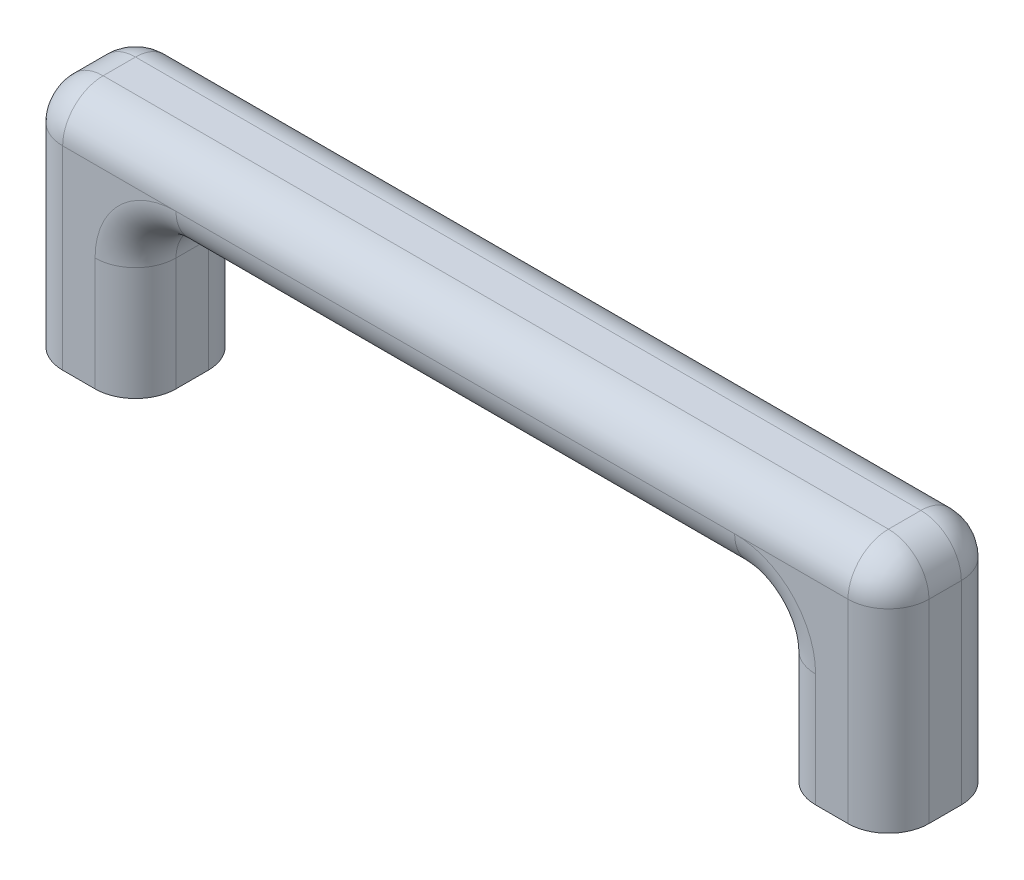
ISO-10303-21;
HEADER;
FILE_DESCRIPTION(('STEP AP214'),'2;1');
FILE_NAME('part.step','',(''),(''),'','','');
FILE_SCHEMA(('AUTOMOTIVE_DESIGN { 1 0 10303 214 1 1 1 1 }'));
ENDSEC;
DATA;
#1=APPLICATION_CONTEXT('core data for automotive mechanical design processes');
#2=APPLICATION_PROTOCOL_DEFINITION('international standard','automotive_design',2000,#1);
#3=PRODUCT_CONTEXT('',#1,'mechanical');
#4=PRODUCT('Part','Part','',(#3));
#5=PRODUCT_RELATED_PRODUCT_CATEGORY('part','',(#4));
#6=PRODUCT_DEFINITION_FORMATION('','',#4);
#7=PRODUCT_DEFINITION_CONTEXT('part definition',#1,'design');
#8=PRODUCT_DEFINITION('design','',#6,#7);
#9=PRODUCT_DEFINITION_SHAPE('','',#8);
#10=(LENGTH_UNIT() NAMED_UNIT(*) SI_UNIT(.MILLI.,.METRE.));
#11=(NAMED_UNIT(*) PLANE_ANGLE_UNIT() SI_UNIT($,.RADIAN.));
#12=(NAMED_UNIT(*) SI_UNIT($,.STERADIAN.) SOLID_ANGLE_UNIT());
#13=UNCERTAINTY_MEASURE_WITH_UNIT(LENGTH_MEASURE(1.E-05),#10,'distance_accuracy_value','');
#14=(GEOMETRIC_REPRESENTATION_CONTEXT(3) GLOBAL_UNCERTAINTY_ASSIGNED_CONTEXT((#13)) GLOBAL_UNIT_ASSIGNED_CONTEXT((#10,
#11,#12)) REPRESENTATION_CONTEXT('',''));
#15=CARTESIAN_POINT('',(0.,0.,0.));
#16=DIRECTION('',(0.,0.,1.));
#17=DIRECTION('',(1.,0.,0.));
#18=AXIS2_PLACEMENT_3D('',#15,#16,#17);
#19=CARTESIAN_POINT('',(0.,0.,14.));
#20=DIRECTION('',(0.,0.,-1.));
#21=DIRECTION('',(-1.,0.,0.));
#22=AXIS2_PLACEMENT_3D('',#19,#20,#21);
#23=PLANE('',#22);
#24=CARTESIAN_POINT('',(34.5,-0.499999999999996,14.));
#25=DIRECTION('',(0.,0.,-1.));
#26=DIRECTION('',(-1.,0.,0.));
#27=AXIS2_PLACEMENT_3D('',#24,#25,#26);
#28=CIRCLE('',#27,10.);
#29=CARTESIAN_POINT('',(44.5,-0.499999999999996,14.));
#30=VERTEX_POINT('',#29);
#31=CARTESIAN_POINT('',(34.5,9.50000000000001,14.));
#32=VERTEX_POINT('',#31);
#33=EDGE_CURVE('E264',#30,#32,#28,.F.);
#34=ORIENTED_EDGE('',*,*,#33,.F.);
#35=DIRECTION('',(0.,1.,0.));
#36=VECTOR('',#35,1.);
#37=CARTESIAN_POINT('',(44.5,0.,14.));
#38=LINE('',#37,#36);
#39=CARTESIAN_POINT('',(44.5,-14.5,14.));
#40=VERTEX_POINT('',#39);
#41=EDGE_CURVE('E200',#30,#40,#38,.F.);
#42=ORIENTED_EDGE('',*,*,#41,.T.);
#43=DIRECTION('',(1.,0.,0.));
#44=VECTOR('',#43,1.);
#45=CARTESIAN_POINT('',(-53.5,-14.5,14.));
#46=LINE('',#45,#44);
#47=CARTESIAN_POINT('',(48.5,-14.5,14.));
#48=VERTEX_POINT('',#47);
#49=EDGE_CURVE('E209',#40,#48,#46,.T.);
#50=ORIENTED_EDGE('',*,*,#49,.T.);
#51=DIRECTION('',(0.,1.,0.));
#52=VECTOR('',#51,1.);
#53=CARTESIAN_POINT('',(48.5,0.,14.));
#54=LINE('',#53,#52);
#55=CARTESIAN_POINT('',(48.5,9.50000000000001,14.));
#56=VERTEX_POINT('',#55);
#57=EDGE_CURVE('E260',#48,#56,#54,.T.);
#58=ORIENTED_EDGE('',*,*,#57,.T.);
#59=DIRECTION('',(-1.,0.,0.));
#60=VECTOR('',#59,1.);
#61=CARTESIAN_POINT('',(0.,9.50000000000001,14.));
#62=LINE('',#61,#60);
#63=EDGE_CURVE('E262',#56,#32,#62,.T.);
#64=ORIENTED_EDGE('',*,*,#63,.T.);
#65=EDGE_LOOP('',(#34,#42,#50,#58,#64));
#66=FACE_BOUND('',#65,.T.);
#67=ADVANCED_FACE('F43',(#66),#23,.F.);
#68=CARTESIAN_POINT('',(0.,0.,0.));
#69=DIRECTION('',(0.,0.,-1.));
#70=DIRECTION('',(-1.,0.,0.));
#71=AXIS2_PLACEMENT_3D('',#68,#69,#70);
#72=PLANE('',#71);
#73=DIRECTION('',(1.,0.,0.));
#74=VECTOR('',#73,1.);
#75=CARTESIAN_POINT('',(-53.5,-14.5,0.));
#76=LINE('',#75,#74);
#77=CARTESIAN_POINT('',(44.5,-14.5,0.));
#78=VERTEX_POINT('',#77);
#79=CARTESIAN_POINT('',(48.5,-14.5,0.));
#80=VERTEX_POINT('',#79);
#81=EDGE_CURVE('E210',#78,#80,#76,.T.);
#82=ORIENTED_EDGE('',*,*,#81,.F.);
#83=DIRECTION('',(0.,1.,0.));
#84=VECTOR('',#83,1.);
#85=CARTESIAN_POINT('',(44.5,4.5,0.));
#86=LINE('',#85,#84);
#87=CARTESIAN_POINT('',(44.5,-0.499999999999996,0.));
#88=VERTEX_POINT('',#87);
#89=EDGE_CURVE('E234',#78,#88,#86,.T.);
#90=ORIENTED_EDGE('',*,*,#89,.T.);
#91=CARTESIAN_POINT('',(34.5,-0.499999999999996,0.));
#92=DIRECTION('',(0.,0.,-1.));
#93=DIRECTION('',(-1.,0.,0.));
#94=AXIS2_PLACEMENT_3D('',#91,#92,#93);
#95=CIRCLE('',#94,10.);
#96=CARTESIAN_POINT('',(34.5,9.50000000000001,0.));
#97=VERTEX_POINT('',#96);
#98=EDGE_CURVE('E231',#97,#88,#95,.T.);
#99=ORIENTED_EDGE('',*,*,#98,.F.);
#100=DIRECTION('',(-1.,0.,0.));
#101=VECTOR('',#100,1.);
#102=CARTESIAN_POINT('',(53.5,9.50000000000001,0.));
#103=LINE('',#102,#101);
#104=CARTESIAN_POINT('',(48.5,9.50000000000001,0.));
#105=VERTEX_POINT('',#104);
#106=EDGE_CURVE('E229',#97,#105,#103,.F.);
#107=ORIENTED_EDGE('',*,*,#106,.T.);
#108=DIRECTION('',(0.,1.,0.));
#109=VECTOR('',#108,1.);
#110=CARTESIAN_POINT('',(48.5,-14.5,0.));
#111=LINE('',#110,#109);
#112=EDGE_CURVE('E227',#105,#80,#111,.F.);
#113=ORIENTED_EDGE('',*,*,#112,.T.);
#114=EDGE_LOOP('',(#82,#90,#99,#107,#113));
#115=FACE_BOUND('',#114,.T.);
#116=ADVANCED_FACE('F439',(#115),#72,.T.);
#117=CARTESIAN_POINT('',(-53.5,-14.5,14.));
#118=DIRECTION('',(0.,1.,0.));
#119=DIRECTION('',(0.,0.,1.));
#120=AXIS2_PLACEMENT_3D('',#117,#118,#119);
#121=PLANE('',#120);
#122=CARTESIAN_POINT('',(46.5,-14.5,7.));
#123=DIRECTION('',(0.,-1.,0.));
#124=DIRECTION('',(0.,0.,-1.));
#125=AXIS2_PLACEMENT_3D('',#122,#123,#124);
#126=CIRCLE('',#125,1.5);
#127=CARTESIAN_POINT('',(46.5,-14.5,5.5));
#128=VERTEX_POINT('',#127);
#129=EDGE_CURVE('E841',#128,#128,#126,.T.);
#130=ORIENTED_EDGE('',*,*,#129,.F.);
#131=EDGE_LOOP('',(#130));
#132=FACE_BOUND('',#131,.T.);
#133=DIRECTION('',(0.,0.,1.));
#134=VECTOR('',#133,1.);
#135=CARTESIAN_POINT('',(39.5,-14.5,0.));
#136=LINE('',#135,#134);
#137=CARTESIAN_POINT('',(39.5,-14.5,5.));
#138=VERTEX_POINT('',#137);
#139=CARTESIAN_POINT('',(39.5,-14.5,9.));
#140=VERTEX_POINT('',#139);
#141=EDGE_CURVE('E386',#138,#140,#136,.T.);
#142=ORIENTED_EDGE('',*,*,#141,.F.);
#143=CARTESIAN_POINT('',(44.5,-14.5,5.));
#144=DIRECTION('',(0.,1.,0.));
#145=DIRECTION('',(0.,0.,1.));
#146=AXIS2_PLACEMENT_3D('',#143,#144,#145);
#147=CIRCLE('',#146,5.);
#148=EDGE_CURVE('E249',#138,#78,#147,.F.);
#149=ORIENTED_EDGE('',*,*,#148,.T.);
#150=ORIENTED_EDGE('',*,*,#81,.T.);
#151=CARTESIAN_POINT('',(48.5,-14.5,5.));
#152=DIRECTION('',(0.,1.,0.));
#153=DIRECTION('',(0.,0.,1.));
#154=AXIS2_PLACEMENT_3D('',#151,#152,#153);
#155=CIRCLE('',#154,5.);
#156=CARTESIAN_POINT('',(53.5,-14.5,5.));
#157=VERTEX_POINT('',#156);
#158=EDGE_CURVE('E245',#80,#157,#155,.F.);
#159=ORIENTED_EDGE('',*,*,#158,.T.);
#160=DIRECTION('',(0.,0.,-1.));
#161=VECTOR('',#160,1.);
#162=CARTESIAN_POINT('',(53.5,-14.5,14.));
#163=LINE('',#162,#161);
#164=CARTESIAN_POINT('',(53.5,-14.5,9.));
#165=VERTEX_POINT('',#164);
#166=EDGE_CURVE('E220',#165,#157,#163,.T.);
#167=ORIENTED_EDGE('',*,*,#166,.F.);
#168=CARTESIAN_POINT('',(48.5,-14.5,9.));
#169=DIRECTION('',(0.,1.,0.));
#170=DIRECTION('',(0.,0.,1.));
#171=AXIS2_PLACEMENT_3D('',#168,#169,#170);
#172=CIRCLE('',#171,5.);
#173=EDGE_CURVE('E243',#165,#48,#172,.F.);
#174=ORIENTED_EDGE('',*,*,#173,.T.);
#175=ORIENTED_EDGE('',*,*,#49,.F.);
#176=CARTESIAN_POINT('',(44.5,-14.5,9.));
#177=DIRECTION('',(0.,1.,0.));
#178=DIRECTION('',(0.,0.,1.));
#179=AXIS2_PLACEMENT_3D('',#176,#177,#178);
#180=CIRCLE('',#179,5.);
#181=EDGE_CURVE('E247',#40,#140,#180,.F.);
#182=ORIENTED_EDGE('',*,*,#181,.T.);
#183=EDGE_LOOP('',(#142,#149,#150,#159,#167,#174,#175,#182));
#184=FACE_BOUND('',#183,.T.);
#185=ADVANCED_FACE('F446',(#132,#184),#121,.F.);
#186=CARTESIAN_POINT('',(53.5,-14.5,14.));
#187=DIRECTION('',(-1.,0.,0.));
#188=DIRECTION('',(0.,0.,1.));
#189=AXIS2_PLACEMENT_3D('',#186,#187,#188);
#190=PLANE('',#189);
#191=ORIENTED_EDGE('',*,*,#166,.T.);
#192=DIRECTION('',(0.,1.,0.));
#193=VECTOR('',#192,1.);
#194=CARTESIAN_POINT('',(53.5,14.5,5.));
#195=LINE('',#194,#193);
#196=CARTESIAN_POINT('',(53.5,9.50000000000001,5.));
#197=VERTEX_POINT('',#196);
#198=EDGE_CURVE('E301',#157,#197,#195,.T.);
#199=ORIENTED_EDGE('',*,*,#198,.T.);
#200=DIRECTION('',(0.,0.,-1.));
#201=VECTOR('',#200,1.);
#202=CARTESIAN_POINT('',(53.5,9.5,14.));
#203=LINE('',#202,#201);
#204=CARTESIAN_POINT('',(53.5,9.50000000000001,9.));
#205=VERTEX_POINT('',#204);
#206=EDGE_CURVE('E299',#197,#205,#203,.F.);
#207=ORIENTED_EDGE('',*,*,#206,.T.);
#208=DIRECTION('',(0.,1.,0.));
#209=VECTOR('',#208,1.);
#210=CARTESIAN_POINT('',(53.5,-14.5,9.));
#211=LINE('',#210,#209);
#212=EDGE_CURVE('E297',#205,#165,#211,.F.);
#213=ORIENTED_EDGE('',*,*,#212,.T.);
#214=EDGE_LOOP('',(#191,#199,#207,#213));
#215=FACE_BOUND('',#214,.T.);
#216=ADVANCED_FACE('F401',(#215),#190,.F.);
#217=CARTESIAN_POINT('',(-53.5,14.5,14.));
#218=DIRECTION('',(0.,-1.,0.));
#219=DIRECTION('',(0.,0.,-1.));
#220=AXIS2_PLACEMENT_3D('',#217,#218,#219);
#221=PLANE('',#220);
#222=DIRECTION('',(-1.,0.,0.));
#223=VECTOR('',#222,1.);
#224=CARTESIAN_POINT('',(-53.5,14.5,9.));
#225=LINE('',#224,#223);
#226=CARTESIAN_POINT('',(-48.5,14.5,9.));
#227=VERTEX_POINT('',#226);
#228=CARTESIAN_POINT('',(48.5,14.5,9.));
#229=VERTEX_POINT('',#228);
#230=EDGE_CURVE('E292',#227,#229,#225,.F.);
#231=ORIENTED_EDGE('',*,*,#230,.T.);
#232=DIRECTION('',(0.,0.,-1.));
#233=VECTOR('',#232,1.);
#234=CARTESIAN_POINT('',(48.5,14.5,14.));
#235=LINE('',#234,#233);
#236=CARTESIAN_POINT('',(48.5,14.5,5.));
#237=VERTEX_POINT('',#236);
#238=EDGE_CURVE('E294',#229,#237,#235,.T.);
#239=ORIENTED_EDGE('',*,*,#238,.T.);
#240=DIRECTION('',(-1.,0.,0.));
#241=VECTOR('',#240,1.);
#242=CARTESIAN_POINT('',(-53.5,14.5,5.));
#243=LINE('',#242,#241);
#244=CARTESIAN_POINT('',(-48.5,14.5,5.));
#245=VERTEX_POINT('',#244);
#246=EDGE_CURVE('E288',#237,#245,#243,.T.);
#247=ORIENTED_EDGE('',*,*,#246,.T.);
#248=DIRECTION('',(0.,0.,-1.));
#249=VECTOR('',#248,1.);
#250=CARTESIAN_POINT('',(-48.5,14.5,14.));
#251=LINE('',#250,#249);
#252=EDGE_CURVE('E290',#245,#227,#251,.F.);
#253=ORIENTED_EDGE('',*,*,#252,.T.);
#254=EDGE_LOOP('',(#231,#239,#247,#253));
#255=FACE_BOUND('',#254,.T.);
#256=ADVANCED_FACE('F419',(#255),#221,.F.);
#257=CARTESIAN_POINT('',(-53.5,-14.5,14.));
#258=DIRECTION('',(1.,0.,0.));
#259=DIRECTION('',(0.,0.,-1.));
#260=AXIS2_PLACEMENT_3D('',#257,#258,#259);
#261=PLANE('',#260);
#262=DIRECTION('',(0.,0.,-1.));
#263=VECTOR('',#262,1.);
#264=CARTESIAN_POINT('',(-53.5,-14.5,14.));
#265=LINE('',#264,#263);
#266=CARTESIAN_POINT('',(-53.5,-14.5,9.));
#267=VERTEX_POINT('',#266);
#268=CARTESIAN_POINT('',(-53.5,-14.5,5.));
#269=VERTEX_POINT('',#268);
#270=EDGE_CURVE('E196',#267,#269,#265,.T.);
#271=ORIENTED_EDGE('',*,*,#270,.F.);
#272=DIRECTION('',(0.,-1.,0.));
#273=VECTOR('',#272,1.);
#274=CARTESIAN_POINT('',(-53.5,-14.5,9.));
#275=LINE('',#274,#273);
#276=CARTESIAN_POINT('',(-53.5,9.5,9.));
#277=VERTEX_POINT('',#276);
#278=EDGE_CURVE('E11',#267,#277,#275,.F.);
#279=ORIENTED_EDGE('',*,*,#278,.T.);
#280=DIRECTION('',(0.,0.,-1.));
#281=VECTOR('',#280,1.);
#282=CARTESIAN_POINT('',(-53.5,9.5,14.));
#283=LINE('',#282,#281);
#284=CARTESIAN_POINT('',(-53.5,9.5,5.));
#285=VERTEX_POINT('',#284);
#286=EDGE_CURVE('E52',#277,#285,#283,.T.);
#287=ORIENTED_EDGE('',*,*,#286,.T.);
#288=DIRECTION('',(0.,-1.,0.));
#289=VECTOR('',#288,1.);
#290=CARTESIAN_POINT('',(-53.5,-14.5,5.));
#291=LINE('',#290,#289);
#292=EDGE_CURVE('E303',#285,#269,#291,.T.);
#293=ORIENTED_EDGE('',*,*,#292,.T.);
#294=EDGE_LOOP('',(#271,#279,#287,#293));
#295=FACE_BOUND('',#294,.T.);
#296=ADVANCED_FACE('F458',(#295),#261,.F.);
#297=CARTESIAN_POINT('',(-46.5,-14.5,7.));
#298=DIRECTION('',(0.,-1.,0.));
#299=DIRECTION('',(0.,0.,-1.));
#300=AXIS2_PLACEMENT_3D('',#297,#298,#299);
#301=CIRCLE('',#300,1.5);
#302=CARTESIAN_POINT('',(-46.5,-14.5,5.5));
#303=VERTEX_POINT('',#302);
#304=EDGE_CURVE('E843',#303,#303,#301,.T.);
#305=ORIENTED_EDGE('',*,*,#304,.F.);
#306=EDGE_LOOP('',(#305));
#307=FACE_BOUND('',#306,.T.);
#308=CARTESIAN_POINT('',(-48.5,-14.5,0.));
#309=VERTEX_POINT('',#308);
#310=CARTESIAN_POINT('',(-44.5,-14.5,0.));
#311=VERTEX_POINT('',#310);
#312=EDGE_CURVE('E195',#309,#311,#76,.T.);
#313=ORIENTED_EDGE('',*,*,#312,.T.);
#314=CARTESIAN_POINT('',(-44.5,-14.5,5.));
#315=DIRECTION('',(0.,1.,0.));
#316=DIRECTION('',(0.,0.,1.));
#317=AXIS2_PLACEMENT_3D('',#314,#315,#316);
#318=CIRCLE('',#317,5.);
#319=CARTESIAN_POINT('',(-39.5,-14.5,5.));
#320=VERTEX_POINT('',#319);
#321=EDGE_CURVE('E271',#311,#320,#318,.F.);
#322=ORIENTED_EDGE('',*,*,#321,.T.);
#323=DIRECTION('',(0.,0.,1.));
#324=VECTOR('',#323,1.);
#325=CARTESIAN_POINT('',(-39.5,-14.5,0.));
#326=LINE('',#325,#324);
#327=CARTESIAN_POINT('',(-39.5,-14.5,9.));
#328=VERTEX_POINT('',#327);
#329=EDGE_CURVE('E381',#320,#328,#326,.T.);
#330=ORIENTED_EDGE('',*,*,#329,.T.);
#331=CARTESIAN_POINT('',(-44.5,-14.5,9.));
#332=DIRECTION('',(0.,1.,0.));
#333=DIRECTION('',(0.,0.,1.));
#334=AXIS2_PLACEMENT_3D('',#331,#332,#333);
#335=CIRCLE('',#334,5.);
#336=CARTESIAN_POINT('',(-44.5,-14.5,14.));
#337=VERTEX_POINT('',#336);
#338=EDGE_CURVE('E269',#328,#337,#335,.F.);
#339=ORIENTED_EDGE('',*,*,#338,.T.);
#340=CARTESIAN_POINT('',(-48.5,-14.5,14.));
#341=VERTEX_POINT('',#340);
#342=EDGE_CURVE('E394',#341,#337,#46,.T.);
#343=ORIENTED_EDGE('',*,*,#342,.F.);
#344=CARTESIAN_POINT('',(-48.5,-14.5,9.));
#345=DIRECTION('',(0.,1.,0.));
#346=DIRECTION('',(0.,0.,1.));
#347=AXIS2_PLACEMENT_3D('',#344,#345,#346);
#348=CIRCLE('',#347,5.);
#349=EDGE_CURVE('E199',#341,#267,#348,.F.);
#350=ORIENTED_EDGE('',*,*,#349,.T.);
#351=ORIENTED_EDGE('',*,*,#270,.T.);
#352=CARTESIAN_POINT('',(-48.5,-14.5,5.));
#353=DIRECTION('',(0.,1.,0.));
#354=DIRECTION('',(0.,0.,1.));
#355=AXIS2_PLACEMENT_3D('',#352,#353,#354);
#356=CIRCLE('',#355,5.);
#357=EDGE_CURVE('E192',#269,#309,#356,.F.);
#358=ORIENTED_EDGE('',*,*,#357,.T.);
#359=EDGE_LOOP('',(#313,#322,#330,#339,#343,#350,#351,#358));
#360=FACE_BOUND('',#359,.T.);
#361=ADVANCED_FACE('F194',(#307,#360),#121,.F.);
#362=ORIENTED_EDGE('',*,*,#342,.T.);
#363=DIRECTION('',(0.,-1.,0.));
#364=VECTOR('',#363,1.);
#365=CARTESIAN_POINT('',(-44.5,0.,14.));
#366=LINE('',#365,#364);
#367=CARTESIAN_POINT('',(-44.5,-0.499999999999996,14.));
#368=VERTEX_POINT('',#367);
#369=EDGE_CURVE('E258',#337,#368,#366,.F.);
#370=ORIENTED_EDGE('',*,*,#369,.T.);
#371=CARTESIAN_POINT('',(-34.5,-0.499999999999996,14.));
#372=DIRECTION('',(0.,0.,-1.));
#373=DIRECTION('',(-1.,0.,0.));
#374=AXIS2_PLACEMENT_3D('',#371,#372,#373);
#375=CIRCLE('',#374,10.);
#376=CARTESIAN_POINT('',(-34.5,9.50000000000001,14.));
#377=VERTEX_POINT('',#376);
#378=EDGE_CURVE('E255',#377,#368,#375,.F.);
#379=ORIENTED_EDGE('',*,*,#378,.F.);
#380=DIRECTION('',(-1.,0.,0.));
#381=VECTOR('',#380,1.);
#382=CARTESIAN_POINT('',(0.,9.50000000000001,14.));
#383=LINE('',#382,#381);
#384=CARTESIAN_POINT('',(-48.5,9.50000000000001,14.));
#385=VERTEX_POINT('',#384);
#386=EDGE_CURVE('E253',#377,#385,#383,.T.);
#387=ORIENTED_EDGE('',*,*,#386,.T.);
#388=DIRECTION('',(0.,-1.,0.));
#389=VECTOR('',#388,1.);
#390=CARTESIAN_POINT('',(-48.5,0.,14.));
#391=LINE('',#390,#389);
#392=EDGE_CURVE('E251',#385,#341,#391,.T.);
#393=ORIENTED_EDGE('',*,*,#392,.T.);
#394=EDGE_LOOP('',(#362,#370,#379,#387,#393));
#395=FACE_BOUND('',#394,.T.);
#396=ADVANCED_FACE('F442',(#395),#23,.F.);
#397=CARTESIAN_POINT('',(-34.5,-0.499999999999996,0.));
#398=DIRECTION('',(0.,0.,-1.));
#399=DIRECTION('',(-1.,0.,0.));
#400=AXIS2_PLACEMENT_3D('',#397,#398,#399);
#401=CIRCLE('',#400,10.);
#402=CARTESIAN_POINT('',(-44.5,-0.499999999999996,0.));
#403=VERTEX_POINT('',#402);
#404=CARTESIAN_POINT('',(-34.5,9.50000000000001,0.));
#405=VERTEX_POINT('',#404);
#406=EDGE_CURVE('E218',#403,#405,#401,.T.);
#407=ORIENTED_EDGE('',*,*,#406,.F.);
#408=DIRECTION('',(0.,-1.,0.));
#409=VECTOR('',#408,1.);
#410=CARTESIAN_POINT('',(-44.5,-14.5,0.));
#411=LINE('',#410,#409);
#412=EDGE_CURVE('E208',#403,#311,#411,.T.);
#413=ORIENTED_EDGE('',*,*,#412,.T.);
#414=ORIENTED_EDGE('',*,*,#312,.F.);
#415=DIRECTION('',(0.,-1.,0.));
#416=VECTOR('',#415,1.);
#417=CARTESIAN_POINT('',(-48.5,14.5,0.));
#418=LINE('',#417,#416);
#419=CARTESIAN_POINT('',(-48.5,9.50000000000001,0.));
#420=VERTEX_POINT('',#419);
#421=EDGE_CURVE('E205',#309,#420,#418,.F.);
#422=ORIENTED_EDGE('',*,*,#421,.T.);
#423=DIRECTION('',(-1.,0.,0.));
#424=VECTOR('',#423,1.);
#425=CARTESIAN_POINT('',(53.5,9.50000000000001,0.));
#426=LINE('',#425,#424);
#427=EDGE_CURVE('E216',#420,#405,#426,.F.);
#428=ORIENTED_EDGE('',*,*,#427,.T.);
#429=EDGE_LOOP('',(#407,#413,#414,#422,#428));
#430=FACE_BOUND('',#429,.T.);
#431=ADVANCED_FACE('F204',(#430),#72,.T.);
#432=CARTESIAN_POINT('',(39.5,4.5,0.));
#433=DIRECTION('',(1.,0.,0.));
#434=DIRECTION('',(0.,0.,-1.));
#435=AXIS2_PLACEMENT_3D('',#432,#433,#434);
#436=PLANE('',#435);
#437=DIRECTION('',(0.,0.,1.));
#438=VECTOR('',#437,1.);
#439=CARTESIAN_POINT('',(39.5,-0.499999999999996,0.));
#440=LINE('',#439,#438);
#441=CARTESIAN_POINT('',(39.5,-0.499999999999996,9.));
#442=VERTEX_POINT('',#441);
#443=CARTESIAN_POINT('',(39.5,-0.499999999999996,5.));
#444=VERTEX_POINT('',#443);
#445=EDGE_CURVE('E237',#442,#444,#440,.F.);
#446=ORIENTED_EDGE('',*,*,#445,.T.);
#447=DIRECTION('',(0.,1.,0.));
#448=VECTOR('',#447,1.);
#449=CARTESIAN_POINT('',(39.5,-14.5,5.));
#450=LINE('',#449,#448);
#451=EDGE_CURVE('E241',#444,#138,#450,.F.);
#452=ORIENTED_EDGE('',*,*,#451,.T.);
#453=ORIENTED_EDGE('',*,*,#141,.T.);
#454=DIRECTION('',(0.,1.,0.));
#455=VECTOR('',#454,1.);
#456=CARTESIAN_POINT('',(39.5,4.5,9.));
#457=LINE('',#456,#455);
#458=EDGE_CURVE('E239',#140,#442,#457,.T.);
#459=ORIENTED_EDGE('',*,*,#458,.T.);
#460=EDGE_LOOP('',(#446,#452,#453,#459));
#461=FACE_BOUND('',#460,.T.);
#462=ADVANCED_FACE('F456',(#461),#436,.F.);
#463=CARTESIAN_POINT('',(-39.5,4.5,0.));
#464=DIRECTION('',(-1.,0.,0.));
#465=DIRECTION('',(0.,0.,1.));
#466=AXIS2_PLACEMENT_3D('',#463,#464,#465);
#467=PLANE('',#466);
#468=ORIENTED_EDGE('',*,*,#329,.F.);
#469=DIRECTION('',(0.,-1.,0.));
#470=VECTOR('',#469,1.);
#471=CARTESIAN_POINT('',(-39.5,4.5,5.));
#472=LINE('',#471,#470);
#473=CARTESIAN_POINT('',(-39.5,-0.499999999999996,5.));
#474=VERTEX_POINT('',#473);
#475=EDGE_CURVE('E277',#320,#474,#472,.F.);
#476=ORIENTED_EDGE('',*,*,#475,.T.);
#477=DIRECTION('',(0.,0.,1.));
#478=VECTOR('',#477,1.);
#479=CARTESIAN_POINT('',(-39.5,-0.499999999999996,14.));
#480=LINE('',#479,#478);
#481=CARTESIAN_POINT('',(-39.5,-0.499999999999996,9.));
#482=VERTEX_POINT('',#481);
#483=EDGE_CURVE('E275',#474,#482,#480,.T.);
#484=ORIENTED_EDGE('',*,*,#483,.T.);
#485=DIRECTION('',(0.,-1.,0.));
#486=VECTOR('',#485,1.);
#487=CARTESIAN_POINT('',(-39.5,4.5,9.));
#488=LINE('',#487,#486);
#489=EDGE_CURVE('E273',#482,#328,#488,.T.);
#490=ORIENTED_EDGE('',*,*,#489,.T.);
#491=EDGE_LOOP('',(#468,#476,#484,#490));
#492=FACE_BOUND('',#491,.T.);
#493=ADVANCED_FACE('F495',(#492),#467,.F.);
#494=CARTESIAN_POINT('',(-39.5,4.5,0.));
#495=DIRECTION('',(0.,1.,0.));
#496=DIRECTION('',(0.,0.,1.));
#497=AXIS2_PLACEMENT_3D('',#494,#495,#496);
#498=PLANE('',#497);
#499=DIRECTION('',(-1.,0.,0.));
#500=VECTOR('',#499,1.);
#501=CARTESIAN_POINT('',(39.5,4.5,5.));
#502=LINE('',#501,#500);
#503=CARTESIAN_POINT('',(-34.5,4.5,5.));
#504=VERTEX_POINT('',#503);
#505=CARTESIAN_POINT('',(34.5,4.5,5.));
#506=VERTEX_POINT('',#505);
#507=EDGE_CURVE('E283',#504,#506,#502,.F.);
#508=ORIENTED_EDGE('',*,*,#507,.T.);
#509=DIRECTION('',(0.,0.,1.));
#510=VECTOR('',#509,1.);
#511=CARTESIAN_POINT('',(34.5,4.5,14.));
#512=LINE('',#511,#510);
#513=CARTESIAN_POINT('',(34.5,4.5,9.));
#514=VERTEX_POINT('',#513);
#515=EDGE_CURVE('E285',#506,#514,#512,.T.);
#516=ORIENTED_EDGE('',*,*,#515,.T.);
#517=DIRECTION('',(-1.,0.,0.));
#518=VECTOR('',#517,1.);
#519=CARTESIAN_POINT('',(-39.5,4.5,9.));
#520=LINE('',#519,#518);
#521=CARTESIAN_POINT('',(-34.5,4.5,9.));
#522=VERTEX_POINT('',#521);
#523=EDGE_CURVE('E279',#514,#522,#520,.T.);
#524=ORIENTED_EDGE('',*,*,#523,.T.);
#525=DIRECTION('',(0.,0.,1.));
#526=VECTOR('',#525,1.);
#527=CARTESIAN_POINT('',(-34.5,4.5,0.));
#528=LINE('',#527,#526);
#529=EDGE_CURVE('E281',#522,#504,#528,.F.);
#530=ORIENTED_EDGE('',*,*,#529,.T.);
#531=EDGE_LOOP('',(#508,#516,#524,#530));
#532=FACE_BOUND('',#531,.T.);
#533=ADVANCED_FACE('F501',(#532),#498,.F.);
#534=CARTESIAN_POINT('',(-48.5,0.,9.));
#535=DIRECTION('',(0.,-1.,0.));
#536=DIRECTION('',(0.,0.,-1.));
#537=AXIS2_PLACEMENT_3D('',#534,#535,#536);
#538=CYLINDRICAL_SURFACE('',#537,5.);
#539=ORIENTED_EDGE('',*,*,#349,.F.);
#540=ORIENTED_EDGE('',*,*,#392,.F.);
#541=CARTESIAN_POINT('',(-48.5,9.5,9.));
#542=DIRECTION('',(0.,1.,0.));
#543=DIRECTION('',(0.,0.,1.));
#544=AXIS2_PLACEMENT_3D('',#541,#542,#543);
#545=CIRCLE('',#544,5.);
#546=EDGE_CURVE('E47',#277,#385,#545,.T.);
#547=ORIENTED_EDGE('',*,*,#546,.F.);
#548=ORIENTED_EDGE('',*,*,#278,.F.);
#549=EDGE_LOOP('',(#539,#540,#547,#548));
#550=FACE_BOUND('',#549,.T.);
#551=ADVANCED_FACE('F45',(#550),#538,.T.);
#552=CARTESIAN_POINT('',(-44.5,4.5,9.));
#553=DIRECTION('',(0.,-1.,0.));
#554=DIRECTION('',(0.,0.,-1.));
#555=AXIS2_PLACEMENT_3D('',#552,#553,#554);
#556=CYLINDRICAL_SURFACE('',#555,5.);
#557=ORIENTED_EDGE('',*,*,#338,.F.);
#558=ORIENTED_EDGE('',*,*,#489,.F.);
#559=CARTESIAN_POINT('',(-44.5,-0.499999999999996,9.));
#560=DIRECTION('',(0.,1.,0.));
#561=DIRECTION('',(0.,0.,1.));
#562=AXIS2_PLACEMENT_3D('',#559,#560,#561);
#563=CIRCLE('',#562,5.);
#564=EDGE_CURVE('E366',#368,#482,#563,.T.);
#565=ORIENTED_EDGE('',*,*,#564,.F.);
#566=ORIENTED_EDGE('',*,*,#369,.F.);
#567=EDGE_LOOP('',(#557,#558,#565,#566));
#568=FACE_BOUND('',#567,.T.);
#569=ADVANCED_FACE('F467',(#568),#556,.T.);
#570=CARTESIAN_POINT('',(-48.5,9.50000000000001,9.));
#571=DIRECTION('',(-1.,0.,0.));
#572=DIRECTION('',(0.,-1.,0.));
#573=AXIS2_PLACEMENT_3D('',#570,#571,#572);
#574=SPHERICAL_SURFACE('',#573,5.);
#575=CARTESIAN_POINT('',(-48.5,9.50000000000001,9.));
#576=DIRECTION('',(-1.,0.,0.));
#577=DIRECTION('',(0.,0.,1.));
#578=AXIS2_PLACEMENT_3D('',#575,#576,#577);
#579=CIRCLE('',#578,5.);
#580=EDGE_CURVE('E363',#227,#385,#579,.F.);
#581=ORIENTED_EDGE('',*,*,#580,.F.);
#582=CARTESIAN_POINT('',(-48.5,9.50000000000001,9.));
#583=DIRECTION('',(0.,0.,1.));
#584=DIRECTION('',(1.,0.,0.));
#585=AXIS2_PLACEMENT_3D('',#582,#583,#584);
#586=CIRCLE('',#585,5.);
#587=EDGE_CURVE('E369',#277,#227,#586,.F.);
#588=ORIENTED_EDGE('',*,*,#587,.F.);
#589=ORIENTED_EDGE('',*,*,#546,.T.);
#590=EDGE_LOOP('',(#581,#588,#589));
#591=FACE_BOUND('',#590,.T.);
#592=ADVANCED_FACE('F435',(#591),#574,.T.);
#593=CARTESIAN_POINT('',(48.5,0.,9.));
#594=DIRECTION('',(0.,1.,0.));
#595=DIRECTION('',(0.,0.,1.));
#596=AXIS2_PLACEMENT_3D('',#593,#594,#595);
#597=CYLINDRICAL_SURFACE('',#596,5.);
#598=CARTESIAN_POINT('',(48.5,9.50000000000001,9.));
#599=DIRECTION('',(0.,1.,0.));
#600=DIRECTION('',(0.,0.,1.));
#601=AXIS2_PLACEMENT_3D('',#598,#599,#600);
#602=CIRCLE('',#601,5.);
#603=EDGE_CURVE('E374',#56,#205,#602,.T.);
#604=ORIENTED_EDGE('',*,*,#603,.F.);
#605=ORIENTED_EDGE('',*,*,#57,.F.);
#606=ORIENTED_EDGE('',*,*,#173,.F.);
#607=ORIENTED_EDGE('',*,*,#212,.F.);
#608=EDGE_LOOP('',(#604,#605,#606,#607));
#609=FACE_BOUND('',#608,.T.);
#610=ADVANCED_FACE('F428',(#609),#597,.T.);
#611=CARTESIAN_POINT('',(48.5,9.50000000000001,9.));
#612=DIRECTION('',(1.,0.,0.));
#613=DIRECTION('',(0.,0.,-1.));
#614=AXIS2_PLACEMENT_3D('',#611,#612,#613);
#615=SPHERICAL_SURFACE('',#614,5.);
#616=CARTESIAN_POINT('',(48.5,9.50000000000001,9.));
#617=DIRECTION('',(1.,0.,0.));
#618=DIRECTION('',(0.,0.,-1.));
#619=AXIS2_PLACEMENT_3D('',#616,#617,#618);
#620=CIRCLE('',#619,5.);
#621=EDGE_CURVE('E360',#56,#229,#620,.F.);
#622=ORIENTED_EDGE('',*,*,#621,.F.);
#623=ORIENTED_EDGE('',*,*,#603,.T.);
#624=CARTESIAN_POINT('',(48.5,9.50000000000001,9.));
#625=DIRECTION('',(0.,0.,1.));
#626=DIRECTION('',(1.,0.,0.));
#627=AXIS2_PLACEMENT_3D('',#624,#625,#626);
#628=CIRCLE('',#627,5.);
#629=EDGE_CURVE('E372',#229,#205,#628,.F.);
#630=ORIENTED_EDGE('',*,*,#629,.F.);
#631=EDGE_LOOP('',(#622,#623,#630));
#632=FACE_BOUND('',#631,.T.);
#633=ADVANCED_FACE('F426',(#632),#615,.T.);
#634=CARTESIAN_POINT('',(48.5,-14.5,5.));
#635=DIRECTION('',(0.,-1.,0.));
#636=DIRECTION('',(0.,0.,-1.));
#637=AXIS2_PLACEMENT_3D('',#634,#635,#636);
#638=CYLINDRICAL_SURFACE('',#637,5.);
#639=ORIENTED_EDGE('',*,*,#158,.F.);
#640=ORIENTED_EDGE('',*,*,#112,.F.);
#641=CARTESIAN_POINT('',(48.5,9.50000000000001,5.));
#642=DIRECTION('',(0.,1.,0.));
#643=DIRECTION('',(0.,0.,1.));
#644=AXIS2_PLACEMENT_3D('',#641,#642,#643);
#645=CIRCLE('',#644,5.);
#646=EDGE_CURVE('E357',#197,#105,#645,.T.);
#647=ORIENTED_EDGE('',*,*,#646,.F.);
#648=ORIENTED_EDGE('',*,*,#198,.F.);
#649=EDGE_LOOP('',(#639,#640,#647,#648));
#650=FACE_BOUND('',#649,.T.);
#651=ADVANCED_FACE('F409',(#650),#638,.T.);
#652=CARTESIAN_POINT('',(48.5,9.50000000000001,14.));
#653=DIRECTION('',(0.,0.,-1.));
#654=DIRECTION('',(-1.,0.,0.));
#655=AXIS2_PLACEMENT_3D('',#652,#653,#654);
#656=CYLINDRICAL_SURFACE('',#655,5.);
#657=ORIENTED_EDGE('',*,*,#629,.T.);
#658=ORIENTED_EDGE('',*,*,#206,.F.);
#659=CARTESIAN_POINT('',(48.5,9.50000000000001,5.));
#660=DIRECTION('',(0.,0.,-1.));
#661=DIRECTION('',(-1.,0.,0.));
#662=AXIS2_PLACEMENT_3D('',#659,#660,#661);
#663=CIRCLE('',#662,5.);
#664=EDGE_CURVE('E354',#237,#197,#663,.T.);
#665=ORIENTED_EDGE('',*,*,#664,.F.);
#666=ORIENTED_EDGE('',*,*,#238,.F.);
#667=EDGE_LOOP('',(#657,#658,#665,#666));
#668=FACE_BOUND('',#667,.T.);
#669=ADVANCED_FACE('F417',(#668),#656,.T.);
#670=CARTESIAN_POINT('',(-48.5,9.5,14.));
#671=DIRECTION('',(0.,0.,-1.));
#672=DIRECTION('',(-1.,0.,0.));
#673=AXIS2_PLACEMENT_3D('',#670,#671,#672);
#674=CYLINDRICAL_SURFACE('',#673,5.);
#675=ORIENTED_EDGE('',*,*,#587,.T.);
#676=ORIENTED_EDGE('',*,*,#252,.F.);
#677=CARTESIAN_POINT('',(-48.5,9.5,5.));
#678=DIRECTION('',(0.,0.,-1.));
#679=DIRECTION('',(-1.,0.,0.));
#680=AXIS2_PLACEMENT_3D('',#677,#678,#679);
#681=CIRCLE('',#680,5.);
#682=EDGE_CURVE('E351',#285,#245,#681,.T.);
#683=ORIENTED_EDGE('',*,*,#682,.F.);
#684=ORIENTED_EDGE('',*,*,#286,.F.);
#685=EDGE_LOOP('',(#675,#676,#683,#684));
#686=FACE_BOUND('',#685,.T.);
#687=ADVANCED_FACE('F477',(#686),#674,.T.);
#688=CARTESIAN_POINT('',(-48.5,-14.5,5.));
#689=DIRECTION('',(0.,1.,0.));
#690=DIRECTION('',(0.,0.,1.));
#691=AXIS2_PLACEMENT_3D('',#688,#689,#690);
#692=CYLINDRICAL_SURFACE('',#691,5.);
#693=ORIENTED_EDGE('',*,*,#357,.F.);
#694=ORIENTED_EDGE('',*,*,#292,.F.);
#695=CARTESIAN_POINT('',(-48.5,9.50000000000001,5.));
#696=DIRECTION('',(0.,1.,0.));
#697=DIRECTION('',(-1.,0.,0.));
#698=AXIS2_PLACEMENT_3D('',#695,#696,#697);
#699=CIRCLE('',#698,5.);
#700=EDGE_CURVE('E214',#420,#285,#699,.T.);
#701=ORIENTED_EDGE('',*,*,#700,.F.);
#702=ORIENTED_EDGE('',*,*,#421,.F.);
#703=EDGE_LOOP('',(#693,#694,#701,#702));
#704=FACE_BOUND('',#703,.T.);
#705=ADVANCED_FACE('F212',(#704),#692,.T.);
#706=CARTESIAN_POINT('',(-34.5,-0.499999999999996,9.));
#707=DIRECTION('',(0.,0.,-1.));
#708=DIRECTION('',(-1.,0.,0.));
#709=AXIS2_PLACEMENT_3D('',#706,#707,#708);
#710=TOROIDAL_SURFACE('',#709,10.,5.);
#711=ORIENTED_EDGE('',*,*,#378,.T.);
#712=ORIENTED_EDGE('',*,*,#564,.T.);
#713=CARTESIAN_POINT('',(-34.5,-0.499999999999996,9.));
#714=DIRECTION('',(0.,0.,-1.));
#715=DIRECTION('',(-1.,0.,0.));
#716=AXIS2_PLACEMENT_3D('',#713,#714,#715);
#717=CIRCLE('',#716,5.);
#718=EDGE_CURVE('E347',#522,#482,#717,.F.);
#719=ORIENTED_EDGE('',*,*,#718,.F.);
#720=CARTESIAN_POINT('',(-34.5,9.50000000000001,9.));
#721=DIRECTION('',(-1.,0.,0.));
#722=DIRECTION('',(0.,0.,1.));
#723=AXIS2_PLACEMENT_3D('',#720,#721,#722);
#724=CIRCLE('',#723,5.);
#725=EDGE_CURVE('E344',#377,#522,#724,.F.);
#726=ORIENTED_EDGE('',*,*,#725,.F.);
#727=EDGE_LOOP('',(#711,#712,#719,#726));
#728=FACE_BOUND('',#727,.T.);
#729=ADVANCED_FACE('F472',(#728),#710,.T.);
#730=CARTESIAN_POINT('',(0.,9.50000000000001,9.));
#731=DIRECTION('',(-1.,0.,0.));
#732=DIRECTION('',(0.,0.,1.));
#733=AXIS2_PLACEMENT_3D('',#730,#731,#732);
#734=CYLINDRICAL_SURFACE('',#733,5.);
#735=ORIENTED_EDGE('',*,*,#580,.T.);
#736=ORIENTED_EDGE('',*,*,#386,.F.);
#737=DIRECTION('',(-1.,0.,0.));
#738=VECTOR('',#737,1.);
#739=CARTESIAN_POINT('',(0.,9.50000000000001,14.));
#740=LINE('',#739,#738);
#741=EDGE_CURVE('E341',#32,#377,#740,.T.);
#742=ORIENTED_EDGE('',*,*,#741,.F.);
#743=ORIENTED_EDGE('',*,*,#63,.F.);
#744=ORIENTED_EDGE('',*,*,#621,.T.);
#745=ORIENTED_EDGE('',*,*,#230,.F.);
#746=EDGE_LOOP('',(#735,#736,#742,#743,#744,#745));
#747=FACE_BOUND('',#746,.T.);
#748=ADVANCED_FACE('F424',(#747),#734,.T.);
#749=CARTESIAN_POINT('',(48.5,9.50000000000001,5.));
#750=DIRECTION('',(1.,0.,0.));
#751=DIRECTION('',(0.,0.,-1.));
#752=AXIS2_PLACEMENT_3D('',#749,#750,#751);
#753=SPHERICAL_SURFACE('',#752,5.);
#754=ORIENTED_EDGE('',*,*,#664,.T.);
#755=ORIENTED_EDGE('',*,*,#646,.T.);
#756=CARTESIAN_POINT('',(48.5,9.50000000000001,5.));
#757=DIRECTION('',(1.,0.,0.));
#758=DIRECTION('',(0.,1.,0.));
#759=AXIS2_PLACEMENT_3D('',#756,#757,#758);
#760=CIRCLE('',#759,5.);
#761=EDGE_CURVE('E338',#237,#105,#760,.F.);
#762=ORIENTED_EDGE('',*,*,#761,.F.);
#763=EDGE_LOOP('',(#754,#755,#762));
#764=FACE_BOUND('',#763,.T.);
#765=ADVANCED_FACE('F414',(#764),#753,.T.);
#766=CARTESIAN_POINT('',(-48.5,9.50000000000001,5.));
#767=DIRECTION('',(-1.,0.,0.));
#768=DIRECTION('',(0.,-1.,0.));
#769=AXIS2_PLACEMENT_3D('',#766,#767,#768);
#770=SPHERICAL_SURFACE('',#769,5.);
#771=ORIENTED_EDGE('',*,*,#700,.T.);
#772=ORIENTED_EDGE('',*,*,#682,.T.);
#773=CARTESIAN_POINT('',(-48.5,9.50000000000001,5.));
#774=DIRECTION('',(-1.,0.,0.));
#775=DIRECTION('',(0.,0.,1.));
#776=AXIS2_PLACEMENT_3D('',#773,#774,#775);
#777=CIRCLE('',#776,5.);
#778=EDGE_CURVE('E335',#420,#245,#777,.F.);
#779=ORIENTED_EDGE('',*,*,#778,.F.);
#780=EDGE_LOOP('',(#771,#772,#779));
#781=FACE_BOUND('',#780,.T.);
#782=ADVANCED_FACE('F479',(#781),#770,.T.);
#783=CARTESIAN_POINT('',(-44.5,0.,5.));
#784=DIRECTION('',(0.,1.,0.));
#785=DIRECTION('',(0.,0.,1.));
#786=AXIS2_PLACEMENT_3D('',#783,#784,#785);
#787=CYLINDRICAL_SURFACE('',#786,5.);
#788=ORIENTED_EDGE('',*,*,#321,.F.);
#789=ORIENTED_EDGE('',*,*,#412,.F.);
#790=CARTESIAN_POINT('',(-44.5,-0.499999999999996,5.));
#791=DIRECTION('',(0.,1.,0.));
#792=DIRECTION('',(0.,0.,1.));
#793=AXIS2_PLACEMENT_3D('',#790,#791,#792);
#794=CIRCLE('',#793,5.);
#795=EDGE_CURVE('E332',#474,#403,#794,.T.);
#796=ORIENTED_EDGE('',*,*,#795,.F.);
#797=ORIENTED_EDGE('',*,*,#475,.F.);
#798=EDGE_LOOP('',(#788,#789,#796,#797));
#799=FACE_BOUND('',#798,.T.);
#800=ADVANCED_FACE('F493',(#799),#787,.T.);
#801=CARTESIAN_POINT('',(-34.5,-0.499999999999996,0.));
#802=DIRECTION('',(0.,0.,-1.));
#803=DIRECTION('',(-1.,0.,0.));
#804=AXIS2_PLACEMENT_3D('',#801,#802,#803);
#805=CYLINDRICAL_SURFACE('',#804,5.);
#806=ORIENTED_EDGE('',*,*,#718,.T.);
#807=ORIENTED_EDGE('',*,*,#483,.F.);
#808=CARTESIAN_POINT('',(-34.5,-0.499999999999996,5.));
#809=DIRECTION('',(0.,0.,-1.));
#810=DIRECTION('',(-1.,0.,0.));
#811=AXIS2_PLACEMENT_3D('',#808,#809,#810);
#812=CIRCLE('',#811,5.);
#813=EDGE_CURVE('E329',#504,#474,#812,.F.);
#814=ORIENTED_EDGE('',*,*,#813,.F.);
#815=ORIENTED_EDGE('',*,*,#529,.F.);
#816=EDGE_LOOP('',(#806,#807,#814,#815));
#817=FACE_BOUND('',#816,.T.);
#818=ADVANCED_FACE('F498',(#817),#805,.F.);
#819=CARTESIAN_POINT('',(-39.5,9.50000000000001,9.));
#820=DIRECTION('',(-1.,0.,0.));
#821=DIRECTION('',(0.,0.,1.));
#822=AXIS2_PLACEMENT_3D('',#819,#820,#821);
#823=CYLINDRICAL_SURFACE('',#822,5.);
#824=ORIENTED_EDGE('',*,*,#725,.T.);
#825=ORIENTED_EDGE('',*,*,#523,.F.);
#826=CARTESIAN_POINT('',(34.5,9.50000000000001,9.));
#827=DIRECTION('',(1.,0.,0.));
#828=DIRECTION('',(0.,0.,-1.));
#829=AXIS2_PLACEMENT_3D('',#826,#827,#828);
#830=CIRCLE('',#829,5.);
#831=EDGE_CURVE('E326',#32,#514,#830,.T.);
#832=ORIENTED_EDGE('',*,*,#831,.F.);
#833=ORIENTED_EDGE('',*,*,#741,.T.);
#834=EDGE_LOOP('',(#824,#825,#832,#833));
#835=FACE_BOUND('',#834,.T.);
#836=ADVANCED_FACE('F505',(#835),#823,.T.);
#837=CARTESIAN_POINT('',(44.5,4.5,9.));
#838=DIRECTION('',(0.,1.,0.));
#839=DIRECTION('',(0.,0.,1.));
#840=AXIS2_PLACEMENT_3D('',#837,#838,#839);
#841=CYLINDRICAL_SURFACE('',#840,5.);
#842=ORIENTED_EDGE('',*,*,#181,.F.);
#843=ORIENTED_EDGE('',*,*,#41,.F.);
#844=CARTESIAN_POINT('',(44.5,-0.499999999999996,9.));
#845=DIRECTION('',(0.,1.,0.));
#846=DIRECTION('',(0.,0.,1.));
#847=AXIS2_PLACEMENT_3D('',#844,#845,#846);
#848=CIRCLE('',#847,5.);
#849=EDGE_CURVE('E323',#442,#30,#848,.T.);
#850=ORIENTED_EDGE('',*,*,#849,.F.);
#851=ORIENTED_EDGE('',*,*,#458,.F.);
#852=EDGE_LOOP('',(#842,#843,#850,#851));
#853=FACE_BOUND('',#852,.T.);
#854=ADVANCED_FACE('F515',(#853),#841,.T.);
#855=CARTESIAN_POINT('',(-53.5,9.50000000000001,5.));
#856=DIRECTION('',(1.,0.,0.));
#857=DIRECTION('',(0.,0.,-1.));
#858=AXIS2_PLACEMENT_3D('',#855,#856,#857);
#859=CYLINDRICAL_SURFACE('',#858,5.);
#860=ORIENTED_EDGE('',*,*,#761,.T.);
#861=ORIENTED_EDGE('',*,*,#106,.F.);
#862=DIRECTION('',(-1.,0.,0.));
#863=VECTOR('',#862,1.);
#864=CARTESIAN_POINT('',(53.5,9.50000000000001,0.));
#865=LINE('',#864,#863);
#866=EDGE_CURVE('E320',#405,#97,#865,.F.);
#867=ORIENTED_EDGE('',*,*,#866,.F.);
#868=ORIENTED_EDGE('',*,*,#427,.F.);
#869=ORIENTED_EDGE('',*,*,#778,.T.);
#870=ORIENTED_EDGE('',*,*,#246,.F.);
#871=EDGE_LOOP('',(#860,#861,#867,#868,#869,#870));
#872=FACE_BOUND('',#871,.T.);
#873=ADVANCED_FACE('F483',(#872),#859,.T.);
#874=CARTESIAN_POINT('',(-34.5,-0.499999999999996,5.));
#875=DIRECTION('',(0.,0.,-1.));
#876=DIRECTION('',(-1.,0.,0.));
#877=AXIS2_PLACEMENT_3D('',#874,#875,#876);
#878=TOROIDAL_SURFACE('',#877,10.,5.);
#879=ORIENTED_EDGE('',*,*,#795,.T.);
#880=ORIENTED_EDGE('',*,*,#406,.T.);
#881=CARTESIAN_POINT('',(-34.5,9.50000000000001,5.));
#882=DIRECTION('',(-1.,0.,0.));
#883=DIRECTION('',(0.,0.,1.));
#884=AXIS2_PLACEMENT_3D('',#881,#882,#883);
#885=CIRCLE('',#884,5.);
#886=EDGE_CURVE('E317',#504,#405,#885,.F.);
#887=ORIENTED_EDGE('',*,*,#886,.F.);
#888=ORIENTED_EDGE('',*,*,#813,.T.);
#889=EDGE_LOOP('',(#879,#880,#887,#888));
#890=FACE_BOUND('',#889,.T.);
#891=ADVANCED_FACE('F487',(#890),#878,.T.);
#892=CARTESIAN_POINT('',(34.5,-0.499999999999996,9.));
#893=DIRECTION('',(0.,0.,-1.));
#894=DIRECTION('',(-1.,0.,0.));
#895=AXIS2_PLACEMENT_3D('',#892,#893,#894);
#896=TOROIDAL_SURFACE('',#895,10.,5.);
#897=ORIENTED_EDGE('',*,*,#33,.T.);
#898=ORIENTED_EDGE('',*,*,#831,.T.);
#899=CARTESIAN_POINT('',(34.5,-0.499999999999996,9.));
#900=DIRECTION('',(0.,0.,-1.));
#901=DIRECTION('',(-1.,0.,0.));
#902=AXIS2_PLACEMENT_3D('',#899,#900,#901);
#903=CIRCLE('',#902,5.);
#904=EDGE_CURVE('E315',#442,#514,#903,.F.);
#905=ORIENTED_EDGE('',*,*,#904,.F.);
#906=ORIENTED_EDGE('',*,*,#849,.T.);
#907=EDGE_LOOP('',(#897,#898,#905,#906));
#908=FACE_BOUND('',#907,.T.);
#909=ADVANCED_FACE('F508',(#908),#896,.T.);
#910=CARTESIAN_POINT('',(0.,9.50000000000001,5.));
#911=DIRECTION('',(1.,0.,0.));
#912=DIRECTION('',(0.,0.,-1.));
#913=AXIS2_PLACEMENT_3D('',#910,#911,#912);
#914=CYLINDRICAL_SURFACE('',#913,5.);
#915=ORIENTED_EDGE('',*,*,#886,.T.);
#916=ORIENTED_EDGE('',*,*,#866,.T.);
#917=CARTESIAN_POINT('',(34.5,9.50000000000001,5.));
#918=DIRECTION('',(1.,0.,0.));
#919=DIRECTION('',(0.,0.,-1.));
#920=AXIS2_PLACEMENT_3D('',#917,#918,#919);
#921=CIRCLE('',#920,5.);
#922=EDGE_CURVE('E312',#506,#97,#921,.T.);
#923=ORIENTED_EDGE('',*,*,#922,.F.);
#924=ORIENTED_EDGE('',*,*,#507,.F.);
#925=EDGE_LOOP('',(#915,#916,#923,#924));
#926=FACE_BOUND('',#925,.T.);
#927=ADVANCED_FACE('F532',(#926),#914,.T.);
#928=CARTESIAN_POINT('',(34.5,-0.499999999999996,0.));
#929=DIRECTION('',(0.,0.,-1.));
#930=DIRECTION('',(-1.,0.,0.));
#931=AXIS2_PLACEMENT_3D('',#928,#929,#930);
#932=CYLINDRICAL_SURFACE('',#931,5.);
#933=ORIENTED_EDGE('',*,*,#904,.T.);
#934=ORIENTED_EDGE('',*,*,#515,.F.);
#935=CARTESIAN_POINT('',(34.5,-0.499999999999996,5.));
#936=DIRECTION('',(0.,0.,-1.));
#937=DIRECTION('',(-1.,0.,0.));
#938=AXIS2_PLACEMENT_3D('',#935,#936,#937);
#939=CIRCLE('',#938,5.);
#940=EDGE_CURVE('E308',#444,#506,#939,.F.);
#941=ORIENTED_EDGE('',*,*,#940,.F.);
#942=ORIENTED_EDGE('',*,*,#445,.F.);
#943=EDGE_LOOP('',(#933,#934,#941,#942));
#944=FACE_BOUND('',#943,.T.);
#945=ADVANCED_FACE('F534',(#944),#932,.F.);
#946=CARTESIAN_POINT('',(34.5,-0.499999999999996,5.));
#947=DIRECTION('',(0.,0.,-1.));
#948=DIRECTION('',(-1.,0.,0.));
#949=AXIS2_PLACEMENT_3D('',#946,#947,#948);
#950=TOROIDAL_SURFACE('',#949,10.,5.);
#951=ORIENTED_EDGE('',*,*,#922,.T.);
#952=ORIENTED_EDGE('',*,*,#98,.T.);
#953=CARTESIAN_POINT('',(44.5,-0.499999999999996,5.));
#954=DIRECTION('',(0.,1.,0.));
#955=DIRECTION('',(0.,0.,1.));
#956=AXIS2_PLACEMENT_3D('',#953,#954,#955);
#957=CIRCLE('',#956,5.);
#958=EDGE_CURVE('E306',#444,#88,#957,.F.);
#959=ORIENTED_EDGE('',*,*,#958,.F.);
#960=ORIENTED_EDGE('',*,*,#940,.T.);
#961=EDGE_LOOP('',(#951,#952,#959,#960));
#962=FACE_BOUND('',#961,.T.);
#963=ADVANCED_FACE('F528',(#962),#950,.T.);
#964=CARTESIAN_POINT('',(44.5,0.,5.));
#965=DIRECTION('',(0.,-1.,0.));
#966=DIRECTION('',(0.,0.,-1.));
#967=AXIS2_PLACEMENT_3D('',#964,#965,#966);
#968=CYLINDRICAL_SURFACE('',#967,5.);
#969=ORIENTED_EDGE('',*,*,#148,.F.);
#970=ORIENTED_EDGE('',*,*,#451,.F.);
#971=ORIENTED_EDGE('',*,*,#958,.T.);
#972=ORIENTED_EDGE('',*,*,#89,.F.);
#973=EDGE_LOOP('',(#969,#970,#971,#972));
#974=FACE_BOUND('',#973,.T.);
#975=ADVANCED_FACE('F525',(#974),#968,.T.);
#976=CARTESIAN_POINT('',(-46.5,-9.5,7.));
#977=DIRECTION('',(0.,-1.,0.));
#978=DIRECTION('',(0.,0.,-1.));
#979=AXIS2_PLACEMENT_3D('',#976,#977,#978);
#980=CYLINDRICAL_SURFACE('',#979,1.5);
#981=CARTESIAN_POINT('',(-46.5,-9.5,7.));
#982=DIRECTION('',(0.,-1.,0.));
#983=DIRECTION('',(0.,0.,-1.));
#984=AXIS2_PLACEMENT_3D('',#981,#982,#983);
#985=CIRCLE('',#984,1.5);
#986=CARTESIAN_POINT('',(-46.5,-9.5,5.5));
#987=VERTEX_POINT('',#986);
#988=EDGE_CURVE('E309',#987,#987,#985,.T.);
#989=ORIENTED_EDGE('',*,*,#988,.F.);
#990=EDGE_LOOP('',(#989));
#991=FACE_BOUND('',#990,.T.);
#992=ORIENTED_EDGE('',*,*,#304,.T.);
#993=EDGE_LOOP('',(#992));
#994=FACE_BOUND('',#993,.T.);
#995=ADVANCED_FACE('F666',(#991,#994),#980,.F.);
#996=CARTESIAN_POINT('',(-46.5,-9.5,7.));
#997=DIRECTION('',(0.,-1.,0.));
#998=DIRECTION('',(0.,0.,-1.));
#999=AXIS2_PLACEMENT_3D('',#996,#997,#998);
#1000=PLANE('',#999);
#1001=ORIENTED_EDGE('',*,*,#988,.T.);
#1002=EDGE_LOOP('',(#1001));
#1003=FACE_BOUND('',#1002,.T.);
#1004=ADVANCED_FACE('F676',(#1003),#1000,.T.);
#1005=CARTESIAN_POINT('',(46.5,-9.5,7.));
#1006=DIRECTION('',(0.,-1.,0.));
#1007=DIRECTION('',(0.,0.,-1.));
#1008=AXIS2_PLACEMENT_3D('',#1005,#1006,#1007);
#1009=CYLINDRICAL_SURFACE('',#1008,1.5);
#1010=CARTESIAN_POINT('',(46.5,-9.5,7.));
#1011=DIRECTION('',(0.,-1.,0.));
#1012=DIRECTION('',(0.,0.,-1.));
#1013=AXIS2_PLACEMENT_3D('',#1010,#1011,#1012);
#1014=CIRCLE('',#1013,1.5);
#1015=CARTESIAN_POINT('',(46.5,-9.5,5.5));
#1016=VERTEX_POINT('',#1015);
#1017=EDGE_CURVE('E844',#1016,#1016,#1014,.T.);
#1018=ORIENTED_EDGE('',*,*,#1017,.F.);
#1019=EDGE_LOOP('',(#1018));
#1020=FACE_BOUND('',#1019,.T.);
#1021=ORIENTED_EDGE('',*,*,#129,.T.);
#1022=EDGE_LOOP('',(#1021));
#1023=FACE_BOUND('',#1022,.T.);
#1024=ADVANCED_FACE('F686',(#1020,#1023),#1009,.F.);
#1025=CARTESIAN_POINT('',(46.5,-9.5,7.));
#1026=DIRECTION('',(0.,-1.,0.));
#1027=DIRECTION('',(0.,0.,-1.));
#1028=AXIS2_PLACEMENT_3D('',#1025,#1026,#1027);
#1029=PLANE('',#1028);
#1030=ORIENTED_EDGE('',*,*,#1017,.T.);
#1031=EDGE_LOOP('',(#1030));
#1032=FACE_BOUND('',#1031,.T.);
#1033=ADVANCED_FACE('F696',(#1032),#1029,.T.);
#1034=CLOSED_SHELL('',(#67,#116,#185,#216,#256,#296,#361,#396,#431,#462,#493,#533,#551,#569,
#592,#610,#633,#651,#669,#687,#705,#729,#748,#765,#782,#800,#818,#836,#854,#873,#891,#909,#927,
#945,#963,#975,#995,#1004,#1024,#1033));
#1035=MANIFOLD_SOLID_BREP('B2',#1034);
#1036=ADVANCED_BREP_SHAPE_REPRESENTATION('',(#18,#1035),#14);
#1037=SHAPE_DEFINITION_REPRESENTATION(#9,#1036);
ENDSEC;
END-ISO-10303-21;
